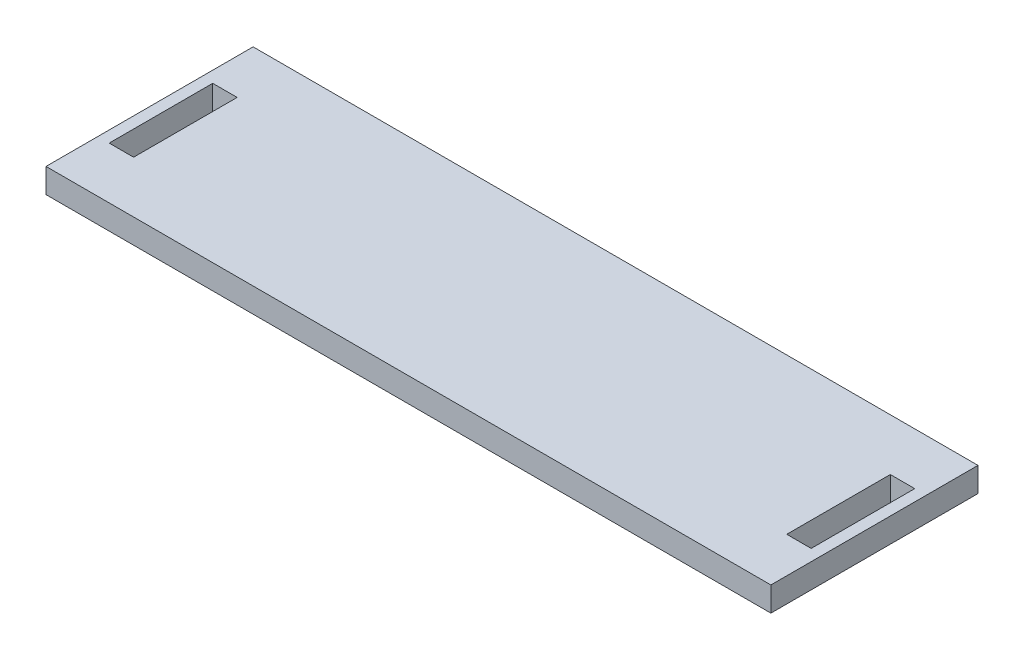
ISO-10303-21;
HEADER;
FILE_DESCRIPTION(('STEP AP214'),'2;1');
FILE_NAME('part.step','',(''),(''),'','','');
FILE_SCHEMA(('AUTOMOTIVE_DESIGN { 1 0 10303 214 1 1 1 1 }'));
ENDSEC;
DATA;
#1=APPLICATION_CONTEXT('core data for automotive mechanical design processes');
#2=APPLICATION_PROTOCOL_DEFINITION('international standard','automotive_design',2000,#1);
#3=PRODUCT_CONTEXT('',#1,'mechanical');
#4=PRODUCT('Part','Part','',(#3));
#5=PRODUCT_RELATED_PRODUCT_CATEGORY('part','',(#4));
#6=PRODUCT_DEFINITION_FORMATION('','',#4);
#7=PRODUCT_DEFINITION_CONTEXT('part definition',#1,'design');
#8=PRODUCT_DEFINITION('design','',#6,#7);
#9=PRODUCT_DEFINITION_SHAPE('','',#8);
#10=(LENGTH_UNIT() NAMED_UNIT(*) SI_UNIT(.MILLI.,.METRE.));
#11=(NAMED_UNIT(*) PLANE_ANGLE_UNIT() SI_UNIT($,.RADIAN.));
#12=(NAMED_UNIT(*) SI_UNIT($,.STERADIAN.) SOLID_ANGLE_UNIT());
#13=UNCERTAINTY_MEASURE_WITH_UNIT(LENGTH_MEASURE(1.E-05),#10,'distance_accuracy_value','');
#14=(GEOMETRIC_REPRESENTATION_CONTEXT(3) GLOBAL_UNCERTAINTY_ASSIGNED_CONTEXT((#13)) GLOBAL_UNIT_ASSIGNED_CONTEXT((#10,
#11,#12)) REPRESENTATION_CONTEXT('',''));
#15=CARTESIAN_POINT('',(0.,0.,0.));
#16=DIRECTION('',(0.,0.,1.));
#17=DIRECTION('',(1.,0.,0.));
#18=AXIS2_PLACEMENT_3D('',#15,#16,#17);
#19=CARTESIAN_POINT('',(0.,5.9944,0.));
#20=DIRECTION('',(0.,1.,0.));
#21=DIRECTION('',(0.,0.,1.));
#22=AXIS2_PLACEMENT_3D('',#19,#20,#21);
#23=PLANE('',#22);
#24=DIRECTION('',(0.,0.,1.));
#25=VECTOR('',#24,1.);
#26=CARTESIAN_POINT('',(0.,5.9944,0.));
#27=LINE('',#26,#25);
#28=CARTESIAN_POINT('',(0.,5.9944,0.));
#29=VERTEX_POINT('',#28);
#30=CARTESIAN_POINT('',(0.,5.9944,50.8));
#31=VERTEX_POINT('',#30);
#32=EDGE_CURVE('E224',#29,#31,#27,.T.);
#33=ORIENTED_EDGE('',*,*,#32,.T.);
#34=DIRECTION('',(1.,0.,0.));
#35=VECTOR('',#34,1.);
#36=CARTESIAN_POINT('',(0.,5.9944,50.8));
#37=LINE('',#36,#35);
#38=CARTESIAN_POINT('',(177.8,5.9944,50.8));
#39=VERTEX_POINT('',#38);
#40=EDGE_CURVE('E228',#31,#39,#37,.T.);
#41=ORIENTED_EDGE('',*,*,#40,.T.);
#42=DIRECTION('',(0.,0.,-1.));
#43=VECTOR('',#42,1.);
#44=CARTESIAN_POINT('',(177.8,5.9944,0.));
#45=LINE('',#44,#43);
#46=CARTESIAN_POINT('',(177.8,5.9944,0.));
#47=VERTEX_POINT('',#46);
#48=EDGE_CURVE('E232',#39,#47,#45,.T.);
#49=ORIENTED_EDGE('',*,*,#48,.T.);
#50=DIRECTION('',(-1.,0.,0.));
#51=VECTOR('',#50,1.);
#52=CARTESIAN_POINT('',(0.,5.9944,0.));
#53=LINE('',#52,#51);
#54=EDGE_CURVE('E235',#47,#29,#53,.T.);
#55=ORIENTED_EDGE('',*,*,#54,.T.);
#56=EDGE_LOOP('',(#33,#41,#49,#55));
#57=FACE_BOUND('',#56,.T.);
#58=DIRECTION('',(1.,0.,0.));
#59=VECTOR('',#58,1.);
#60=CARTESIAN_POINT('',(2.794,5.9944,38.1));
#61=LINE('',#60,#59);
#62=CARTESIAN_POINT('',(2.794,5.9944,38.1));
#63=VERTEX_POINT('',#62);
#64=CARTESIAN_POINT('',(8.7884,5.9944,38.1));
#65=VERTEX_POINT('',#64);
#66=EDGE_CURVE('E184',#63,#65,#61,.T.);
#67=ORIENTED_EDGE('',*,*,#66,.F.);
#68=DIRECTION('',(0.,0.,1.));
#69=VECTOR('',#68,1.);
#70=CARTESIAN_POINT('',(2.794,5.9944,12.7));
#71=LINE('',#70,#69);
#72=CARTESIAN_POINT('',(2.794,5.9944,12.7));
#73=VERTEX_POINT('',#72);
#74=EDGE_CURVE('E181',#73,#63,#71,.T.);
#75=ORIENTED_EDGE('',*,*,#74,.F.);
#76=DIRECTION('',(-1.,0.,0.));
#77=VECTOR('',#76,1.);
#78=CARTESIAN_POINT('',(2.794,5.9944,12.7));
#79=LINE('',#78,#77);
#80=CARTESIAN_POINT('',(8.7884,5.9944,12.7));
#81=VERTEX_POINT('',#80);
#82=EDGE_CURVE('E192',#81,#73,#79,.T.);
#83=ORIENTED_EDGE('',*,*,#82,.F.);
#84=DIRECTION('',(0.,0.,-1.));
#85=VECTOR('',#84,1.);
#86=CARTESIAN_POINT('',(8.7884,5.9944,12.7));
#87=LINE('',#86,#85);
#88=EDGE_CURVE('E188',#65,#81,#87,.T.);
#89=ORIENTED_EDGE('',*,*,#88,.F.);
#90=EDGE_LOOP('',(#67,#75,#83,#89));
#91=FACE_BOUND('',#90,.T.);
#92=DIRECTION('',(-1.,0.,0.));
#93=VECTOR('',#92,1.);
#94=CARTESIAN_POINT('',(174.9828,5.9944,12.7));
#95=LINE('',#94,#93);
#96=CARTESIAN_POINT('',(174.9828,5.9944,12.7));
#97=VERTEX_POINT('',#96);
#98=CARTESIAN_POINT('',(168.9884,5.9944,12.7));
#99=VERTEX_POINT('',#98);
#100=EDGE_CURVE('E142',#97,#99,#95,.T.);
#101=ORIENTED_EDGE('',*,*,#100,.F.);
#102=DIRECTION('',(0.,0.,-1.));
#103=VECTOR('',#102,1.);
#104=CARTESIAN_POINT('',(174.9828,5.9944,12.7));
#105=LINE('',#104,#103);
#106=CARTESIAN_POINT('',(174.9828,5.9944,38.1));
#107=VERTEX_POINT('',#106);
#108=EDGE_CURVE('E133',#107,#97,#105,.T.);
#109=ORIENTED_EDGE('',*,*,#108,.F.);
#110=DIRECTION('',(1.,0.,0.));
#111=VECTOR('',#110,1.);
#112=CARTESIAN_POINT('',(174.9828,5.9944,38.1));
#113=LINE('',#112,#111);
#114=CARTESIAN_POINT('',(168.9884,5.9944,38.1));
#115=VERTEX_POINT('',#114);
#116=EDGE_CURVE('E159',#115,#107,#113,.T.);
#117=ORIENTED_EDGE('',*,*,#116,.F.);
#118=DIRECTION('',(0.,0.,1.));
#119=VECTOR('',#118,1.);
#120=CARTESIAN_POINT('',(168.9884,5.9944,12.7));
#121=LINE('',#120,#119);
#122=EDGE_CURVE('E155',#99,#115,#121,.T.);
#123=ORIENTED_EDGE('',*,*,#122,.F.);
#124=EDGE_LOOP('',(#101,#109,#117,#123));
#125=FACE_BOUND('',#124,.T.);
#126=ADVANCED_FACE('F43',(#57,#91,#125),#23,.T.);
#127=CARTESIAN_POINT('',(0.,0.,0.));
#128=DIRECTION('',(0.,1.,0.));
#129=DIRECTION('',(0.,0.,1.));
#130=AXIS2_PLACEMENT_3D('',#127,#128,#129);
#131=PLANE('',#130);
#132=DIRECTION('',(0.,0.,1.));
#133=VECTOR('',#132,1.);
#134=CARTESIAN_POINT('',(2.794,0.,12.7));
#135=LINE('',#134,#133);
#136=CARTESIAN_POINT('',(2.794,0.,12.7));
#137=VERTEX_POINT('',#136);
#138=CARTESIAN_POINT('',(2.794,0.,38.1));
#139=VERTEX_POINT('',#138);
#140=EDGE_CURVE('E151',#137,#139,#135,.T.);
#141=ORIENTED_EDGE('',*,*,#140,.T.);
#142=DIRECTION('',(1.,0.,0.));
#143=VECTOR('',#142,1.);
#144=CARTESIAN_POINT('',(2.794,0.,38.1));
#145=LINE('',#144,#143);
#146=CARTESIAN_POINT('',(8.7884,0.,38.1));
#147=VERTEX_POINT('',#146);
#148=EDGE_CURVE('E199',#139,#147,#145,.T.);
#149=ORIENTED_EDGE('',*,*,#148,.T.);
#150=DIRECTION('',(0.,0.,-1.));
#151=VECTOR('',#150,1.);
#152=CARTESIAN_POINT('',(8.7884,0.,12.7));
#153=LINE('',#152,#151);
#154=CARTESIAN_POINT('',(8.7884,0.,12.7));
#155=VERTEX_POINT('',#154);
#156=EDGE_CURVE('E203',#147,#155,#153,.T.);
#157=ORIENTED_EDGE('',*,*,#156,.T.);
#158=DIRECTION('',(-1.,0.,0.));
#159=VECTOR('',#158,1.);
#160=CARTESIAN_POINT('',(2.794,0.,12.7));
#161=LINE('',#160,#159);
#162=EDGE_CURVE('E185',#155,#137,#161,.T.);
#163=ORIENTED_EDGE('',*,*,#162,.T.);
#164=EDGE_LOOP('',(#141,#149,#157,#163));
#165=FACE_BOUND('',#164,.T.);
#166=DIRECTION('',(0.,0.,1.));
#167=VECTOR('',#166,1.);
#168=CARTESIAN_POINT('',(0.,0.,0.));
#169=LINE('',#168,#167);
#170=CARTESIAN_POINT('',(0.,0.,0.));
#171=VERTEX_POINT('',#170);
#172=CARTESIAN_POINT('',(0.,0.,50.8));
#173=VERTEX_POINT('',#172);
#174=EDGE_CURVE('E223',#171,#173,#169,.T.);
#175=ORIENTED_EDGE('',*,*,#174,.F.);
#176=DIRECTION('',(-1.,0.,0.));
#177=VECTOR('',#176,1.);
#178=CARTESIAN_POINT('',(0.,0.,0.));
#179=LINE('',#178,#177);
#180=CARTESIAN_POINT('',(177.8,0.,0.));
#181=VERTEX_POINT('',#180);
#182=EDGE_CURVE('E229',#181,#171,#179,.T.);
#183=ORIENTED_EDGE('',*,*,#182,.F.);
#184=DIRECTION('',(0.,0.,-1.));
#185=VECTOR('',#184,1.);
#186=CARTESIAN_POINT('',(177.8,0.,0.));
#187=LINE('',#186,#185);
#188=CARTESIAN_POINT('',(177.8,0.,50.8));
#189=VERTEX_POINT('',#188);
#190=EDGE_CURVE('E245',#189,#181,#187,.T.);
#191=ORIENTED_EDGE('',*,*,#190,.F.);
#192=DIRECTION('',(1.,0.,0.));
#193=VECTOR('',#192,1.);
#194=CARTESIAN_POINT('',(0.,0.,50.8));
#195=LINE('',#194,#193);
#196=EDGE_CURVE('E242',#173,#189,#195,.T.);
#197=ORIENTED_EDGE('',*,*,#196,.F.);
#198=EDGE_LOOP('',(#175,#183,#191,#197));
#199=FACE_BOUND('',#198,.T.);
#200=DIRECTION('',(0.,0.,-1.));
#201=VECTOR('',#200,1.);
#202=CARTESIAN_POINT('',(174.9828,0.,12.7));
#203=LINE('',#202,#201);
#204=CARTESIAN_POINT('',(174.9828,0.,38.1));
#205=VERTEX_POINT('',#204);
#206=CARTESIAN_POINT('',(174.9828,0.,12.7));
#207=VERTEX_POINT('',#206);
#208=EDGE_CURVE('E67',#205,#207,#203,.T.);
#209=ORIENTED_EDGE('',*,*,#208,.T.);
#210=DIRECTION('',(-1.,0.,0.));
#211=VECTOR('',#210,1.);
#212=CARTESIAN_POINT('',(174.9828,0.,12.7));
#213=LINE('',#212,#211);
#214=CARTESIAN_POINT('',(168.9884,0.,12.7));
#215=VERTEX_POINT('',#214);
#216=EDGE_CURVE('E149',#207,#215,#213,.T.);
#217=ORIENTED_EDGE('',*,*,#216,.T.);
#218=DIRECTION('',(0.,0.,1.));
#219=VECTOR('',#218,1.);
#220=CARTESIAN_POINT('',(168.9884,0.,12.7));
#221=LINE('',#220,#219);
#222=CARTESIAN_POINT('',(168.9884,0.,38.1));
#223=VERTEX_POINT('',#222);
#224=EDGE_CURVE('E168',#215,#223,#221,.T.);
#225=ORIENTED_EDGE('',*,*,#224,.T.);
#226=DIRECTION('',(1.,0.,0.));
#227=VECTOR('',#226,1.);
#228=CARTESIAN_POINT('',(174.9828,0.,38.1));
#229=LINE('',#228,#227);
#230=EDGE_CURVE('E143',#223,#205,#229,.T.);
#231=ORIENTED_EDGE('',*,*,#230,.T.);
#232=EDGE_LOOP('',(#209,#217,#225,#231));
#233=FACE_BOUND('',#232,.T.);
#234=ADVANCED_FACE('F268',(#165,#199,#233),#131,.F.);
#235=CARTESIAN_POINT('',(0.,5.9944,0.));
#236=DIRECTION('',(1.,0.,0.));
#237=DIRECTION('',(0.,0.,-1.));
#238=AXIS2_PLACEMENT_3D('',#235,#236,#237);
#239=PLANE('',#238);
#240=ORIENTED_EDGE('',*,*,#174,.T.);
#241=DIRECTION('',(0.,-1.,0.));
#242=VECTOR('',#241,1.);
#243=CARTESIAN_POINT('',(0.,5.9944,50.8));
#244=LINE('',#243,#242);
#245=EDGE_CURVE('E11',#31,#173,#244,.T.);
#246=ORIENTED_EDGE('',*,*,#245,.F.);
#247=ORIENTED_EDGE('',*,*,#32,.F.);
#248=DIRECTION('',(0.,-1.,0.));
#249=VECTOR('',#248,1.);
#250=CARTESIAN_POINT('',(0.,5.9944,0.));
#251=LINE('',#250,#249);
#252=EDGE_CURVE('E238',#29,#171,#251,.T.);
#253=ORIENTED_EDGE('',*,*,#252,.T.);
#254=EDGE_LOOP('',(#240,#246,#247,#253));
#255=FACE_BOUND('',#254,.T.);
#256=ADVANCED_FACE('F45',(#255),#239,.F.);
#257=CARTESIAN_POINT('',(0.,5.9944,50.8));
#258=DIRECTION('',(0.,0.,-1.));
#259=DIRECTION('',(-1.,0.,0.));
#260=AXIS2_PLACEMENT_3D('',#257,#258,#259);
#261=PLANE('',#260);
#262=ORIENTED_EDGE('',*,*,#196,.T.);
#263=DIRECTION('',(0.,-1.,0.));
#264=VECTOR('',#263,1.);
#265=CARTESIAN_POINT('',(177.8,5.9944,50.8));
#266=LINE('',#265,#264);
#267=EDGE_CURVE('E52',#39,#189,#266,.T.);
#268=ORIENTED_EDGE('',*,*,#267,.F.);
#269=ORIENTED_EDGE('',*,*,#40,.F.);
#270=ORIENTED_EDGE('',*,*,#245,.T.);
#271=EDGE_LOOP('',(#262,#268,#269,#270));
#272=FACE_BOUND('',#271,.T.);
#273=ADVANCED_FACE('F279',(#272),#261,.F.);
#274=CARTESIAN_POINT('',(177.8,5.9944,0.));
#275=DIRECTION('',(-1.,0.,0.));
#276=DIRECTION('',(0.,0.,1.));
#277=AXIS2_PLACEMENT_3D('',#274,#275,#276);
#278=PLANE('',#277);
#279=ORIENTED_EDGE('',*,*,#190,.T.);
#280=DIRECTION('',(0.,-1.,0.));
#281=VECTOR('',#280,1.);
#282=CARTESIAN_POINT('',(177.8,5.9944,0.));
#283=LINE('',#282,#281);
#284=EDGE_CURVE('E253',#47,#181,#283,.T.);
#285=ORIENTED_EDGE('',*,*,#284,.F.);
#286=ORIENTED_EDGE('',*,*,#48,.F.);
#287=ORIENTED_EDGE('',*,*,#267,.T.);
#288=EDGE_LOOP('',(#279,#285,#286,#287));
#289=FACE_BOUND('',#288,.T.);
#290=ADVANCED_FACE('F262',(#289),#278,.F.);
#291=CARTESIAN_POINT('',(0.,5.9944,0.));
#292=DIRECTION('',(0.,0.,1.));
#293=DIRECTION('',(1.,0.,0.));
#294=AXIS2_PLACEMENT_3D('',#291,#292,#293);
#295=PLANE('',#294);
#296=ORIENTED_EDGE('',*,*,#182,.T.);
#297=ORIENTED_EDGE('',*,*,#252,.F.);
#298=ORIENTED_EDGE('',*,*,#54,.F.);
#299=ORIENTED_EDGE('',*,*,#284,.T.);
#300=EDGE_LOOP('',(#296,#297,#298,#299));
#301=FACE_BOUND('',#300,.T.);
#302=ADVANCED_FACE('F272',(#301),#295,.F.);
#303=CARTESIAN_POINT('',(2.794,5.9944,12.7));
#304=DIRECTION('',(1.,0.,0.));
#305=DIRECTION('',(0.,0.,-1.));
#306=AXIS2_PLACEMENT_3D('',#303,#304,#305);
#307=PLANE('',#306);
#308=ORIENTED_EDGE('',*,*,#140,.F.);
#309=DIRECTION('',(0.,-1.,0.));
#310=VECTOR('',#309,1.);
#311=CARTESIAN_POINT('',(2.794,5.9944,12.7));
#312=LINE('',#311,#310);
#313=EDGE_CURVE('E195',#73,#137,#312,.T.);
#314=ORIENTED_EDGE('',*,*,#313,.F.);
#315=ORIENTED_EDGE('',*,*,#74,.T.);
#316=DIRECTION('',(0.,-1.,0.));
#317=VECTOR('',#316,1.);
#318=CARTESIAN_POINT('',(2.794,5.9944,38.1));
#319=LINE('',#318,#317);
#320=EDGE_CURVE('E219',#63,#139,#319,.T.);
#321=ORIENTED_EDGE('',*,*,#320,.T.);
#322=EDGE_LOOP('',(#308,#314,#315,#321));
#323=FACE_BOUND('',#322,.T.);
#324=ADVANCED_FACE('F294',(#323),#307,.T.);
#325=CARTESIAN_POINT('',(2.794,5.9944,38.1));
#326=DIRECTION('',(0.,0.,-1.));
#327=DIRECTION('',(-1.,0.,0.));
#328=AXIS2_PLACEMENT_3D('',#325,#326,#327);
#329=PLANE('',#328);
#330=ORIENTED_EDGE('',*,*,#148,.F.);
#331=ORIENTED_EDGE('',*,*,#320,.F.);
#332=ORIENTED_EDGE('',*,*,#66,.T.);
#333=DIRECTION('',(0.,-1.,0.));
#334=VECTOR('',#333,1.);
#335=CARTESIAN_POINT('',(8.7884,5.9944,38.1));
#336=LINE('',#335,#334);
#337=EDGE_CURVE('E216',#65,#147,#336,.T.);
#338=ORIENTED_EDGE('',*,*,#337,.T.);
#339=EDGE_LOOP('',(#330,#331,#332,#338));
#340=FACE_BOUND('',#339,.T.);
#341=ADVANCED_FACE('F301',(#340),#329,.T.);
#342=CARTESIAN_POINT('',(8.7884,5.9944,12.7));
#343=DIRECTION('',(-1.,0.,0.));
#344=DIRECTION('',(0.,0.,1.));
#345=AXIS2_PLACEMENT_3D('',#342,#343,#344);
#346=PLANE('',#345);
#347=ORIENTED_EDGE('',*,*,#156,.F.);
#348=ORIENTED_EDGE('',*,*,#337,.F.);
#349=ORIENTED_EDGE('',*,*,#88,.T.);
#350=DIRECTION('',(0.,-1.,0.));
#351=VECTOR('',#350,1.);
#352=CARTESIAN_POINT('',(8.7884,5.9944,12.7));
#353=LINE('',#352,#351);
#354=EDGE_CURVE('E213',#81,#155,#353,.T.);
#355=ORIENTED_EDGE('',*,*,#354,.T.);
#356=EDGE_LOOP('',(#347,#348,#349,#355));
#357=FACE_BOUND('',#356,.T.);
#358=ADVANCED_FACE('F306',(#357),#346,.T.);
#359=CARTESIAN_POINT('',(2.794,5.9944,12.7));
#360=DIRECTION('',(0.,0.,1.));
#361=DIRECTION('',(1.,0.,0.));
#362=AXIS2_PLACEMENT_3D('',#359,#360,#361);
#363=PLANE('',#362);
#364=ORIENTED_EDGE('',*,*,#162,.F.);
#365=ORIENTED_EDGE('',*,*,#354,.F.);
#366=ORIENTED_EDGE('',*,*,#82,.T.);
#367=ORIENTED_EDGE('',*,*,#313,.T.);
#368=EDGE_LOOP('',(#364,#365,#366,#367));
#369=FACE_BOUND('',#368,.T.);
#370=ADVANCED_FACE('F313',(#369),#363,.T.);
#371=CARTESIAN_POINT('',(174.9828,5.9944,12.7));
#372=DIRECTION('',(-1.,0.,0.));
#373=DIRECTION('',(0.,0.,1.));
#374=AXIS2_PLACEMENT_3D('',#371,#372,#373);
#375=PLANE('',#374);
#376=ORIENTED_EDGE('',*,*,#208,.F.);
#377=DIRECTION('',(0.,-1.,0.));
#378=VECTOR('',#377,1.);
#379=CARTESIAN_POINT('',(174.9828,5.9944,38.1));
#380=LINE('',#379,#378);
#381=EDGE_CURVE('E137',#107,#205,#380,.T.);
#382=ORIENTED_EDGE('',*,*,#381,.F.);
#383=ORIENTED_EDGE('',*,*,#108,.T.);
#384=DIRECTION('',(0.,-1.,0.));
#385=VECTOR('',#384,1.);
#386=CARTESIAN_POINT('',(174.9828,5.9944,12.7));
#387=LINE('',#386,#385);
#388=EDGE_CURVE('E136',#97,#207,#387,.T.);
#389=ORIENTED_EDGE('',*,*,#388,.T.);
#390=EDGE_LOOP('',(#376,#382,#383,#389));
#391=FACE_BOUND('',#390,.T.);
#392=ADVANCED_FACE('F135',(#391),#375,.T.);
#393=CARTESIAN_POINT('',(174.9828,5.9944,12.7));
#394=DIRECTION('',(0.,0.,1.));
#395=DIRECTION('',(1.,0.,0.));
#396=AXIS2_PLACEMENT_3D('',#393,#394,#395);
#397=PLANE('',#396);
#398=ORIENTED_EDGE('',*,*,#216,.F.);
#399=ORIENTED_EDGE('',*,*,#388,.F.);
#400=ORIENTED_EDGE('',*,*,#100,.T.);
#401=DIRECTION('',(0.,-1.,0.));
#402=VECTOR('',#401,1.);
#403=CARTESIAN_POINT('',(168.9884,5.9944,12.7));
#404=LINE('',#403,#402);
#405=EDGE_CURVE('E152',#99,#215,#404,.T.);
#406=ORIENTED_EDGE('',*,*,#405,.T.);
#407=EDGE_LOOP('',(#398,#399,#400,#406));
#408=FACE_BOUND('',#407,.T.);
#409=ADVANCED_FACE('F146',(#408),#397,.T.);
#410=CARTESIAN_POINT('',(168.9884,5.9944,12.7));
#411=DIRECTION('',(1.,0.,0.));
#412=DIRECTION('',(0.,0.,-1.));
#413=AXIS2_PLACEMENT_3D('',#410,#411,#412);
#414=PLANE('',#413);
#415=ORIENTED_EDGE('',*,*,#224,.F.);
#416=ORIENTED_EDGE('',*,*,#405,.F.);
#417=ORIENTED_EDGE('',*,*,#122,.T.);
#418=DIRECTION('',(0.,-1.,0.));
#419=VECTOR('',#418,1.);
#420=CARTESIAN_POINT('',(168.9884,5.9944,38.1));
#421=LINE('',#420,#419);
#422=EDGE_CURVE('E59',#115,#223,#421,.T.);
#423=ORIENTED_EDGE('',*,*,#422,.T.);
#424=EDGE_LOOP('',(#415,#416,#417,#423));
#425=FACE_BOUND('',#424,.T.);
#426=ADVANCED_FACE('F331',(#425),#414,.T.);
#427=CARTESIAN_POINT('',(174.9828,5.9944,38.1));
#428=DIRECTION('',(0.,0.,-1.));
#429=DIRECTION('',(-1.,0.,0.));
#430=AXIS2_PLACEMENT_3D('',#427,#428,#429);
#431=PLANE('',#430);
#432=ORIENTED_EDGE('',*,*,#230,.F.);
#433=ORIENTED_EDGE('',*,*,#422,.F.);
#434=ORIENTED_EDGE('',*,*,#116,.T.);
#435=ORIENTED_EDGE('',*,*,#381,.T.);
#436=EDGE_LOOP('',(#432,#433,#434,#435));
#437=FACE_BOUND('',#436,.T.);
#438=ADVANCED_FACE('F334',(#437),#431,.T.);
#439=CLOSED_SHELL('',(#126,#234,#256,#273,#290,#302,#324,#341,#358,#370,#392,#409,#426,#438));
#440=MANIFOLD_SOLID_BREP('B2',#439);
#441=ADVANCED_BREP_SHAPE_REPRESENTATION('',(#18,#440),#14);
#442=SHAPE_DEFINITION_REPRESENTATION(#9,#441);
ENDSEC;
END-ISO-10303-21;
